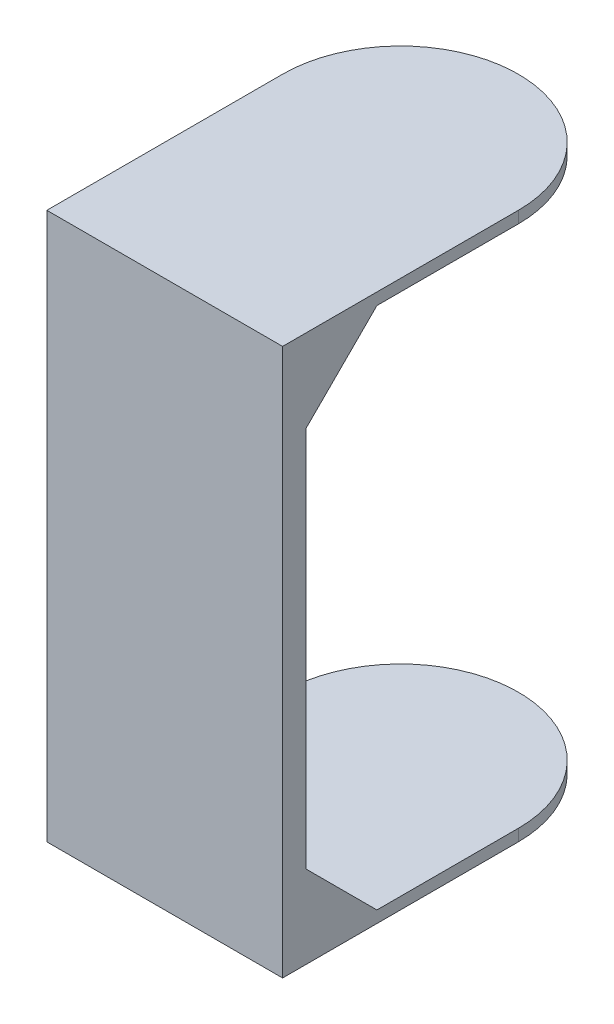
ISO-10303-21;
HEADER;
FILE_DESCRIPTION(('STEP AP214'),'2;1');
FILE_NAME('part.step','',(''),(''),'','','');
FILE_SCHEMA(('AUTOMOTIVE_DESIGN { 1 0 10303 214 1 1 1 1 }'));
ENDSEC;
DATA;
#1=APPLICATION_CONTEXT('core data for automotive mechanical design processes');
#2=APPLICATION_PROTOCOL_DEFINITION('international standard','automotive_design',2000,#1);
#3=PRODUCT_CONTEXT('',#1,'mechanical');
#4=PRODUCT('Part','Part','',(#3));
#5=PRODUCT_RELATED_PRODUCT_CATEGORY('part','',(#4));
#6=PRODUCT_DEFINITION_FORMATION('','',#4);
#7=PRODUCT_DEFINITION_CONTEXT('part definition',#1,'design');
#8=PRODUCT_DEFINITION('design','',#6,#7);
#9=PRODUCT_DEFINITION_SHAPE('','',#8);
#10=(LENGTH_UNIT() NAMED_UNIT(*) SI_UNIT(.MILLI.,.METRE.));
#11=(NAMED_UNIT(*) PLANE_ANGLE_UNIT() SI_UNIT($,.RADIAN.));
#12=(NAMED_UNIT(*) SI_UNIT($,.STERADIAN.) SOLID_ANGLE_UNIT());
#13=UNCERTAINTY_MEASURE_WITH_UNIT(LENGTH_MEASURE(1.E-05),#10,'distance_accuracy_value','');
#14=(GEOMETRIC_REPRESENTATION_CONTEXT(3) GLOBAL_UNCERTAINTY_ASSIGNED_CONTEXT((#13)) GLOBAL_UNIT_ASSIGNED_CONTEXT((#10,
#11,#12)) REPRESENTATION_CONTEXT('',''));
#15=CARTESIAN_POINT('',(0.,0.,0.));
#16=DIRECTION('',(0.,0.,1.));
#17=DIRECTION('',(1.,0.,0.));
#18=AXIS2_PLACEMENT_3D('',#15,#16,#17);
#19=CARTESIAN_POINT('',(0.,0.,-10.));
#20=DIRECTION('',(0.,0.,1.));
#21=DIRECTION('',(1.,0.,0.));
#22=AXIS2_PLACEMENT_3D('',#19,#20,#21);
#23=PLANE('',#22);
#24=DIRECTION('',(0.,-1.,0.));
#25=VECTOR('',#24,1.);
#26=CARTESIAN_POINT('',(-50.,111.,-10.));
#27=LINE('',#26,#25);
#28=CARTESIAN_POINT('',(-50.,81.,-10.));
#29=VERTEX_POINT('',#28);
#30=CARTESIAN_POINT('',(-50.,-111.,-10.));
#31=VERTEX_POINT('',#30);
#32=EDGE_CURVE('E49',#29,#31,#27,.T.);
#33=ORIENTED_EDGE('',*,*,#32,.F.);
#34=DIRECTION('',(-1.,0.,0.));
#35=VECTOR('',#34,1.);
#36=CARTESIAN_POINT('',(-40.,81.,-10.));
#37=LINE('',#36,#35);
#38=CARTESIAN_POINT('',(-40.,81.,-10.));
#39=VERTEX_POINT('',#38);
#40=EDGE_CURVE('E237',#39,#29,#37,.T.);
#41=ORIENTED_EDGE('',*,*,#40,.F.);
#42=DIRECTION('',(0.,1.,0.));
#43=VECTOR('',#42,1.);
#44=CARTESIAN_POINT('',(-40.,111.,-10.));
#45=LINE('',#44,#43);
#46=CARTESIAN_POINT('',(-40.,111.,-10.));
#47=VERTEX_POINT('',#46);
#48=EDGE_CURVE('E221',#39,#47,#45,.T.);
#49=ORIENTED_EDGE('',*,*,#48,.T.);
#50=DIRECTION('',(-1.,0.,0.));
#51=VECTOR('',#50,1.);
#52=CARTESIAN_POINT('',(-50.,111.,-10.));
#53=LINE('',#52,#51);
#54=CARTESIAN_POINT('',(40.,111.,-10.));
#55=VERTEX_POINT('',#54);
#56=EDGE_CURVE('E285',#55,#47,#53,.T.);
#57=ORIENTED_EDGE('',*,*,#56,.F.);
#58=DIRECTION('',(0.,-1.,0.));
#59=VECTOR('',#58,1.);
#60=CARTESIAN_POINT('',(40.,111.,-10.));
#61=LINE('',#60,#59);
#62=CARTESIAN_POINT('',(40.,81.,-10.));
#63=VERTEX_POINT('',#62);
#64=EDGE_CURVE('E266',#55,#63,#61,.T.);
#65=ORIENTED_EDGE('',*,*,#64,.T.);
#66=DIRECTION('',(1.,0.,0.));
#67=VECTOR('',#66,1.);
#68=CARTESIAN_POINT('',(40.,81.,-10.));
#69=LINE('',#68,#67);
#70=CARTESIAN_POINT('',(50.,81.,-10.));
#71=VERTEX_POINT('',#70);
#72=EDGE_CURVE('E274',#63,#71,#69,.T.);
#73=ORIENTED_EDGE('',*,*,#72,.T.);
#74=DIRECTION('',(0.,1.,0.));
#75=VECTOR('',#74,1.);
#76=CARTESIAN_POINT('',(50.,111.,-10.));
#77=LINE('',#76,#75);
#78=CARTESIAN_POINT('',(50.,-81.,-10.));
#79=VERTEX_POINT('',#78);
#80=EDGE_CURVE('E62',#79,#71,#77,.T.);
#81=ORIENTED_EDGE('',*,*,#80,.F.);
#82=DIRECTION('',(1.,0.,0.));
#83=VECTOR('',#82,1.);
#84=CARTESIAN_POINT('',(40.,-81.,-10.));
#85=LINE('',#84,#83);
#86=CARTESIAN_POINT('',(40.,-81.,-10.));
#87=VERTEX_POINT('',#86);
#88=EDGE_CURVE('E255',#87,#79,#85,.T.);
#89=ORIENTED_EDGE('',*,*,#88,.F.);
#90=DIRECTION('',(0.,1.,0.));
#91=VECTOR('',#90,1.);
#92=CARTESIAN_POINT('',(40.,-111.,-10.));
#93=LINE('',#92,#91);
#94=CARTESIAN_POINT('',(40.,-111.,-10.));
#95=VERTEX_POINT('',#94);
#96=EDGE_CURVE('E249',#95,#87,#93,.T.);
#97=ORIENTED_EDGE('',*,*,#96,.F.);
#98=DIRECTION('',(1.,0.,0.));
#99=VECTOR('',#98,1.);
#100=CARTESIAN_POINT('',(-50.,-111.,-10.));
#101=LINE('',#100,#99);
#102=EDGE_CURVE('E11',#31,#95,#101,.T.);
#103=ORIENTED_EDGE('',*,*,#102,.F.);
#104=EDGE_LOOP('',(#33,#41,#49,#57,#65,#73,#81,#89,#97,#103));
#105=FACE_BOUND('',#104,.T.);
#106=ADVANCED_FACE('F39',(#105),#23,.F.);
#107=CARTESIAN_POINT('',(50.,111.,-10.));
#108=DIRECTION('',(1.,0.,0.));
#109=DIRECTION('',(0.,1.,0.));
#110=AXIS2_PLACEMENT_3D('',#107,#108,#109);
#111=PLANE('',#110);
#112=DIRECTION('',(0.,1.,0.));
#113=VECTOR('',#112,1.);
#114=CARTESIAN_POINT('',(50.,111.,0.));
#115=LINE('',#114,#113);
#116=CARTESIAN_POINT('',(50.,-116.,0.));
#117=VERTEX_POINT('',#116);
#118=CARTESIAN_POINT('',(50.,116.,0.));
#119=VERTEX_POINT('',#118);
#120=EDGE_CURVE('E168',#117,#119,#115,.T.);
#121=ORIENTED_EDGE('',*,*,#120,.F.);
#122=DIRECTION('',(0.,0.,-1.));
#123=VECTOR('',#122,1.);
#124=CARTESIAN_POINT('',(50.,-116.,0.));
#125=LINE('',#124,#123);
#126=CARTESIAN_POINT('',(50.,-116.,-100.));
#127=VERTEX_POINT('',#126);
#128=EDGE_CURVE('E160',#117,#127,#125,.T.);
#129=ORIENTED_EDGE('',*,*,#128,.T.);
#130=DIRECTION('',(0.,1.,0.));
#131=VECTOR('',#130,1.);
#132=CARTESIAN_POINT('',(50.,-116.,-100.));
#133=LINE('',#132,#131);
#134=CARTESIAN_POINT('',(50.,-111.,-100.));
#135=VERTEX_POINT('',#134);
#136=EDGE_CURVE('E144',#127,#135,#133,.T.);
#137=ORIENTED_EDGE('',*,*,#136,.T.);
#138=DIRECTION('',(0.,0.,-1.));
#139=VECTOR('',#138,1.);
#140=CARTESIAN_POINT('',(50.,-111.,0.));
#141=LINE('',#140,#139);
#142=CARTESIAN_POINT('',(50.,-111.,-40.));
#143=VERTEX_POINT('',#142);
#144=EDGE_CURVE('E179',#143,#135,#141,.T.);
#145=ORIENTED_EDGE('',*,*,#144,.F.);
#146=DIRECTION('',(0.,-0.707106781186548,-0.707106781186547));
#147=VECTOR('',#146,1.);
#148=CARTESIAN_POINT('',(50.,-81.,-10.));
#149=LINE('',#148,#147);
#150=EDGE_CURVE('E57',#79,#143,#149,.T.);
#151=ORIENTED_EDGE('',*,*,#150,.F.);
#152=ORIENTED_EDGE('',*,*,#80,.T.);
#153=DIRECTION('',(0.,0.707106781186548,-0.707106781186547));
#154=VECTOR('',#153,1.);
#155=CARTESIAN_POINT('',(50.,81.,-10.));
#156=LINE('',#155,#154);
#157=CARTESIAN_POINT('',(50.,111.,-40.));
#158=VERTEX_POINT('',#157);
#159=EDGE_CURVE('E258',#71,#158,#156,.T.);
#160=ORIENTED_EDGE('',*,*,#159,.T.);
#161=DIRECTION('',(0.,0.,-1.));
#162=VECTOR('',#161,1.);
#163=CARTESIAN_POINT('',(50.,111.,0.));
#164=LINE('',#163,#162);
#165=CARTESIAN_POINT('',(50.,111.,-100.));
#166=VERTEX_POINT('',#165);
#167=EDGE_CURVE('E192',#158,#166,#164,.T.);
#168=ORIENTED_EDGE('',*,*,#167,.T.);
#169=DIRECTION('',(0.,-1.,0.));
#170=VECTOR('',#169,1.);
#171=CARTESIAN_POINT('',(50.,116.,-100.));
#172=LINE('',#171,#170);
#173=CARTESIAN_POINT('',(50.,116.,-100.));
#174=VERTEX_POINT('',#173);
#175=EDGE_CURVE('E203',#174,#166,#172,.T.);
#176=ORIENTED_EDGE('',*,*,#175,.F.);
#177=DIRECTION('',(0.,0.,-1.));
#178=VECTOR('',#177,1.);
#179=CARTESIAN_POINT('',(50.,116.,0.));
#180=LINE('',#179,#178);
#181=EDGE_CURVE('E200',#119,#174,#180,.T.);
#182=ORIENTED_EDGE('',*,*,#181,.F.);
#183=EDGE_LOOP('',(#121,#129,#137,#145,#151,#152,#160,#168,#176,#182));
#184=FACE_BOUND('',#183,.T.);
#185=ADVANCED_FACE('F41',(#184),#111,.T.);
#186=CARTESIAN_POINT('',(-50.,111.,-10.));
#187=DIRECTION('',(-1.,0.,0.));
#188=DIRECTION('',(0.,-1.,0.));
#189=AXIS2_PLACEMENT_3D('',#186,#187,#188);
#190=PLANE('',#189);
#191=DIRECTION('',(0.,-1.,0.));
#192=VECTOR('',#191,1.);
#193=CARTESIAN_POINT('',(-50.,111.,0.));
#194=LINE('',#193,#192);
#195=CARTESIAN_POINT('',(-50.,116.,0.));
#196=VERTEX_POINT('',#195);
#197=CARTESIAN_POINT('',(-50.,-116.,0.));
#198=VERTEX_POINT('',#197);
#199=EDGE_CURVE('E43',#196,#198,#194,.T.);
#200=ORIENTED_EDGE('',*,*,#199,.F.);
#201=DIRECTION('',(0.,0.,1.));
#202=VECTOR('',#201,1.);
#203=CARTESIAN_POINT('',(-50.,116.,0.));
#204=LINE('',#203,#202);
#205=CARTESIAN_POINT('',(-50.,116.,-100.));
#206=VERTEX_POINT('',#205);
#207=EDGE_CURVE('E191',#206,#196,#204,.T.);
#208=ORIENTED_EDGE('',*,*,#207,.F.);
#209=DIRECTION('',(0.,-1.,0.));
#210=VECTOR('',#209,1.);
#211=CARTESIAN_POINT('',(-50.,116.,-100.));
#212=LINE('',#211,#210);
#213=CARTESIAN_POINT('',(-50.,111.,-100.));
#214=VERTEX_POINT('',#213);
#215=EDGE_CURVE('E216',#206,#214,#212,.T.);
#216=ORIENTED_EDGE('',*,*,#215,.T.);
#217=DIRECTION('',(0.,0.,1.));
#218=VECTOR('',#217,1.);
#219=CARTESIAN_POINT('',(-50.,111.,0.));
#220=LINE('',#219,#218);
#221=CARTESIAN_POINT('',(-50.,111.,-40.));
#222=VERTEX_POINT('',#221);
#223=EDGE_CURVE('E207',#214,#222,#220,.T.);
#224=ORIENTED_EDGE('',*,*,#223,.T.);
#225=DIRECTION('',(0.,-0.707106781186548,0.707106781186547));
#226=VECTOR('',#225,1.);
#227=CARTESIAN_POINT('',(-50.,81.,-10.));
#228=LINE('',#227,#226);
#229=EDGE_CURVE('E220',#222,#29,#228,.T.);
#230=ORIENTED_EDGE('',*,*,#229,.T.);
#231=ORIENTED_EDGE('',*,*,#32,.T.);
#232=DIRECTION('',(0.,0.,1.));
#233=VECTOR('',#232,1.);
#234=CARTESIAN_POINT('',(-50.,-111.,0.));
#235=LINE('',#234,#233);
#236=CARTESIAN_POINT('',(-50.,-111.,-100.));
#237=VERTEX_POINT('',#236);
#238=EDGE_CURVE('E165',#237,#31,#235,.T.);
#239=ORIENTED_EDGE('',*,*,#238,.F.);
#240=DIRECTION('',(0.,1.,0.));
#241=VECTOR('',#240,1.);
#242=CARTESIAN_POINT('',(-50.,-116.,-100.));
#243=LINE('',#242,#241);
#244=CARTESIAN_POINT('',(-50.,-116.,-100.));
#245=VERTEX_POINT('',#244);
#246=EDGE_CURVE('E154',#245,#237,#243,.T.);
#247=ORIENTED_EDGE('',*,*,#246,.F.);
#248=DIRECTION('',(0.,0.,1.));
#249=VECTOR('',#248,1.);
#250=CARTESIAN_POINT('',(-50.,-116.,0.));
#251=LINE('',#250,#249);
#252=EDGE_CURVE('E163',#245,#198,#251,.T.);
#253=ORIENTED_EDGE('',*,*,#252,.T.);
#254=EDGE_LOOP('',(#200,#208,#216,#224,#230,#231,#239,#247,#253));
#255=FACE_BOUND('',#254,.T.);
#256=ADVANCED_FACE('F296',(#255),#190,.T.);
#257=CARTESIAN_POINT('',(0.,0.,0.));
#258=DIRECTION('',(0.,0.,1.));
#259=DIRECTION('',(1.,0.,0.));
#260=AXIS2_PLACEMENT_3D('',#257,#258,#259);
#261=PLANE('',#260);
#262=ORIENTED_EDGE('',*,*,#120,.T.);
#263=DIRECTION('',(1.,0.,0.));
#264=VECTOR('',#263,1.);
#265=CARTESIAN_POINT('',(-50.,116.,0.));
#266=LINE('',#265,#264);
#267=EDGE_CURVE('E196',#196,#119,#266,.T.);
#268=ORIENTED_EDGE('',*,*,#267,.F.);
#269=ORIENTED_EDGE('',*,*,#199,.T.);
#270=DIRECTION('',(1.,0.,0.));
#271=VECTOR('',#270,1.);
#272=CARTESIAN_POINT('',(-50.,-116.,0.));
#273=LINE('',#272,#271);
#274=EDGE_CURVE('E170',#198,#117,#273,.T.);
#275=ORIENTED_EDGE('',*,*,#274,.T.);
#276=EDGE_LOOP('',(#262,#268,#269,#275));
#277=FACE_BOUND('',#276,.T.);
#278=ADVANCED_FACE('F294',(#277),#261,.T.);
#279=CARTESIAN_POINT('',(40.,81.,-10.));
#280=DIRECTION('',(0.,-0.707106781186547,-0.707106781186548));
#281=DIRECTION('',(0.,0.707106781186548,-0.707106781186547));
#282=AXIS2_PLACEMENT_3D('',#279,#280,#281);
#283=PLANE('',#282);
#284=ORIENTED_EDGE('',*,*,#159,.F.);
#285=ORIENTED_EDGE('',*,*,#72,.F.);
#286=DIRECTION('',(0.,0.707106781186548,-0.707106781186547));
#287=VECTOR('',#286,1.);
#288=CARTESIAN_POINT('',(40.,81.,-10.));
#289=LINE('',#288,#287);
#290=CARTESIAN_POINT('',(40.,111.,-40.));
#291=VERTEX_POINT('',#290);
#292=EDGE_CURVE('E270',#63,#291,#289,.T.);
#293=ORIENTED_EDGE('',*,*,#292,.T.);
#294=DIRECTION('',(1.,0.,0.));
#295=VECTOR('',#294,1.);
#296=CARTESIAN_POINT('',(40.,111.,-40.));
#297=LINE('',#296,#295);
#298=EDGE_CURVE('E277',#291,#158,#297,.T.);
#299=ORIENTED_EDGE('',*,*,#298,.T.);
#300=EDGE_LOOP('',(#284,#285,#293,#299));
#301=FACE_BOUND('',#300,.T.);
#302=ADVANCED_FACE('F312',(#301),#283,.T.);
#303=CARTESIAN_POINT('',(40.,0.,0.));
#304=DIRECTION('',(1.,0.,0.));
#305=DIRECTION('',(0.,1.,0.));
#306=AXIS2_PLACEMENT_3D('',#303,#304,#305);
#307=PLANE('',#306);
#308=DIRECTION('',(0.,0.,1.));
#309=VECTOR('',#308,1.);
#310=CARTESIAN_POINT('',(40.,111.,-40.));
#311=LINE('',#310,#309);
#312=EDGE_CURVE('E262',#291,#55,#311,.T.);
#313=ORIENTED_EDGE('',*,*,#312,.F.);
#314=ORIENTED_EDGE('',*,*,#292,.F.);
#315=ORIENTED_EDGE('',*,*,#64,.F.);
#316=EDGE_LOOP('',(#313,#314,#315));
#317=FACE_BOUND('',#316,.T.);
#318=ADVANCED_FACE('F315',(#317),#307,.F.);
#319=CARTESIAN_POINT('',(40.,-81.,-10.));
#320=DIRECTION('',(0.,-0.707106781186547,0.707106781186548));
#321=DIRECTION('',(0.,-0.707106781186548,-0.707106781186547));
#322=AXIS2_PLACEMENT_3D('',#319,#320,#321);
#323=PLANE('',#322);
#324=ORIENTED_EDGE('',*,*,#150,.T.);
#325=DIRECTION('',(1.,0.,0.));
#326=VECTOR('',#325,1.);
#327=CARTESIAN_POINT('',(40.,-111.,-40.));
#328=LINE('',#327,#326);
#329=CARTESIAN_POINT('',(40.,-111.,-40.));
#330=VERTEX_POINT('',#329);
#331=EDGE_CURVE('E252',#330,#143,#328,.T.);
#332=ORIENTED_EDGE('',*,*,#331,.F.);
#333=DIRECTION('',(0.,-0.707106781186548,-0.707106781186547));
#334=VECTOR('',#333,1.);
#335=CARTESIAN_POINT('',(40.,-81.,-10.));
#336=LINE('',#335,#334);
#337=EDGE_CURVE('E246',#87,#330,#336,.T.);
#338=ORIENTED_EDGE('',*,*,#337,.F.);
#339=ORIENTED_EDGE('',*,*,#88,.T.);
#340=EDGE_LOOP('',(#324,#332,#338,#339));
#341=FACE_BOUND('',#340,.T.);
#342=ADVANCED_FACE('F304',(#341),#323,.F.);
#343=CARTESIAN_POINT('',(40.,0.,0.));
#344=DIRECTION('',(1.,0.,0.));
#345=DIRECTION('',(0.,-1.,0.));
#346=AXIS2_PLACEMENT_3D('',#343,#344,#345);
#347=PLANE('',#346);
#348=DIRECTION('',(0.,0.,1.));
#349=VECTOR('',#348,1.);
#350=CARTESIAN_POINT('',(40.,-111.,-40.));
#351=LINE('',#350,#349);
#352=EDGE_CURVE('E243',#330,#95,#351,.T.);
#353=ORIENTED_EDGE('',*,*,#352,.T.);
#354=ORIENTED_EDGE('',*,*,#96,.T.);
#355=ORIENTED_EDGE('',*,*,#337,.T.);
#356=EDGE_LOOP('',(#353,#354,#355));
#357=FACE_BOUND('',#356,.T.);
#358=ADVANCED_FACE('F372',(#357),#347,.F.);
#359=CARTESIAN_POINT('',(-40.,81.,-10.));
#360=DIRECTION('',(0.,-0.707106781186547,-0.707106781186548));
#361=DIRECTION('',(0.,0.707106781186548,-0.707106781186547));
#362=AXIS2_PLACEMENT_3D('',#359,#360,#361);
#363=PLANE('',#362);
#364=ORIENTED_EDGE('',*,*,#229,.F.);
#365=DIRECTION('',(-1.,0.,0.));
#366=VECTOR('',#365,1.);
#367=CARTESIAN_POINT('',(-40.,111.,-40.));
#368=LINE('',#367,#366);
#369=CARTESIAN_POINT('',(-40.,111.,-40.));
#370=VERTEX_POINT('',#369);
#371=EDGE_CURVE('E233',#370,#222,#368,.T.);
#372=ORIENTED_EDGE('',*,*,#371,.F.);
#373=DIRECTION('',(0.,-0.707106781186548,0.707106781186547));
#374=VECTOR('',#373,1.);
#375=CARTESIAN_POINT('',(-40.,81.,-10.));
#376=LINE('',#375,#374);
#377=EDGE_CURVE('E229',#370,#39,#376,.T.);
#378=ORIENTED_EDGE('',*,*,#377,.T.);
#379=ORIENTED_EDGE('',*,*,#40,.T.);
#380=EDGE_LOOP('',(#364,#372,#378,#379));
#381=FACE_BOUND('',#380,.T.);
#382=ADVANCED_FACE('F379',(#381),#363,.T.);
#383=CARTESIAN_POINT('',(-40.,0.,0.));
#384=DIRECTION('',(-1.,0.,0.));
#385=DIRECTION('',(0.,-1.,0.));
#386=AXIS2_PLACEMENT_3D('',#383,#384,#385);
#387=PLANE('',#386);
#388=ORIENTED_EDGE('',*,*,#48,.F.);
#389=ORIENTED_EDGE('',*,*,#377,.F.);
#390=DIRECTION('',(0.,0.,-1.));
#391=VECTOR('',#390,1.);
#392=CARTESIAN_POINT('',(-40.,111.,-40.));
#393=LINE('',#392,#391);
#394=EDGE_CURVE('E225',#47,#370,#393,.T.);
#395=ORIENTED_EDGE('',*,*,#394,.F.);
#396=EDGE_LOOP('',(#388,#389,#395));
#397=FACE_BOUND('',#396,.T.);
#398=ADVANCED_FACE('F334',(#397),#387,.F.);
#399=CARTESIAN_POINT('',(0.,116.,-100.));
#400=DIRECTION('',(0.,-1.,0.));
#401=DIRECTION('',(0.,0.,-1.));
#402=AXIS2_PLACEMENT_3D('',#399,#400,#401);
#403=CYLINDRICAL_SURFACE('',#402,50.);
#404=CARTESIAN_POINT('',(0.,111.,-100.));
#405=DIRECTION('',(0.,1.,0.));
#406=DIRECTION('',(0.,0.,1.));
#407=AXIS2_PLACEMENT_3D('',#404,#405,#406);
#408=CIRCLE('',#407,50.);
#409=EDGE_CURVE('E153',#166,#214,#408,.T.);
#410=ORIENTED_EDGE('',*,*,#409,.T.);
#411=ORIENTED_EDGE('',*,*,#215,.F.);
#412=CARTESIAN_POINT('',(0.,116.,-100.));
#413=DIRECTION('',(0.,1.,0.));
#414=DIRECTION('',(0.,0.,1.));
#415=AXIS2_PLACEMENT_3D('',#412,#413,#414);
#416=CIRCLE('',#415,50.);
#417=EDGE_CURVE('E187',#174,#206,#416,.T.);
#418=ORIENTED_EDGE('',*,*,#417,.F.);
#419=ORIENTED_EDGE('',*,*,#175,.T.);
#420=EDGE_LOOP('',(#410,#411,#418,#419));
#421=FACE_BOUND('',#420,.T.);
#422=ADVANCED_FACE('F323',(#421),#403,.T.);
#423=CARTESIAN_POINT('',(0.,116.,-100.));
#424=DIRECTION('',(0.,1.,0.));
#425=DIRECTION('',(0.,0.,1.));
#426=AXIS2_PLACEMENT_3D('',#423,#424,#425);
#427=PLANE('',#426);
#428=ORIENTED_EDGE('',*,*,#417,.T.);
#429=ORIENTED_EDGE('',*,*,#207,.T.);
#430=ORIENTED_EDGE('',*,*,#267,.T.);
#431=ORIENTED_EDGE('',*,*,#181,.T.);
#432=EDGE_LOOP('',(#428,#429,#430,#431));
#433=FACE_BOUND('',#432,.T.);
#434=ADVANCED_FACE('F326',(#433),#427,.T.);
#435=CARTESIAN_POINT('',(0.,111.,-100.));
#436=DIRECTION('',(0.,1.,0.));
#437=DIRECTION('',(0.,0.,1.));
#438=AXIS2_PLACEMENT_3D('',#435,#436,#437);
#439=PLANE('',#438);
#440=ORIENTED_EDGE('',*,*,#298,.F.);
#441=ORIENTED_EDGE('',*,*,#312,.T.);
#442=ORIENTED_EDGE('',*,*,#56,.T.);
#443=ORIENTED_EDGE('',*,*,#394,.T.);
#444=ORIENTED_EDGE('',*,*,#371,.T.);
#445=ORIENTED_EDGE('',*,*,#223,.F.);
#446=ORIENTED_EDGE('',*,*,#409,.F.);
#447=ORIENTED_EDGE('',*,*,#167,.F.);
#448=EDGE_LOOP('',(#440,#441,#442,#443,#444,#445,#446,#447));
#449=FACE_BOUND('',#448,.T.);
#450=ADVANCED_FACE('F317',(#449),#439,.F.);
#451=CARTESIAN_POINT('',(0.,-111.,-100.));
#452=DIRECTION('',(0.,-1.,0.));
#453=DIRECTION('',(0.,0.,1.));
#454=AXIS2_PLACEMENT_3D('',#451,#452,#453);
#455=PLANE('',#454);
#456=ORIENTED_EDGE('',*,*,#238,.T.);
#457=ORIENTED_EDGE('',*,*,#102,.T.);
#458=ORIENTED_EDGE('',*,*,#352,.F.);
#459=ORIENTED_EDGE('',*,*,#331,.T.);
#460=ORIENTED_EDGE('',*,*,#144,.T.);
#461=CARTESIAN_POINT('',(0.,-111.,-100.));
#462=DIRECTION('',(0.,1.,0.));
#463=DIRECTION('',(0.,0.,1.));
#464=AXIS2_PLACEMENT_3D('',#461,#462,#463);
#465=CIRCLE('',#464,50.);
#466=EDGE_CURVE('E150',#135,#237,#465,.T.);
#467=ORIENTED_EDGE('',*,*,#466,.T.);
#468=EDGE_LOOP('',(#456,#457,#458,#459,#460,#467));
#469=FACE_BOUND('',#468,.T.);
#470=ADVANCED_FACE('F299',(#469),#455,.F.);
#471=CARTESIAN_POINT('',(0.,-116.,-100.));
#472=DIRECTION('',(0.,1.,0.));
#473=DIRECTION('',(0.,0.,1.));
#474=AXIS2_PLACEMENT_3D('',#471,#472,#473);
#475=CYLINDRICAL_SURFACE('',#474,50.);
#476=ORIENTED_EDGE('',*,*,#466,.F.);
#477=ORIENTED_EDGE('',*,*,#136,.F.);
#478=CARTESIAN_POINT('',(0.,-116.,-100.));
#479=DIRECTION('',(0.,1.,0.));
#480=DIRECTION('',(0.,0.,1.));
#481=AXIS2_PLACEMENT_3D('',#478,#479,#480);
#482=CIRCLE('',#481,50.);
#483=EDGE_CURVE('E147',#127,#245,#482,.T.);
#484=ORIENTED_EDGE('',*,*,#483,.T.);
#485=ORIENTED_EDGE('',*,*,#246,.T.);
#486=EDGE_LOOP('',(#476,#477,#484,#485));
#487=FACE_BOUND('',#486,.T.);
#488=ADVANCED_FACE('F146',(#487),#475,.T.);
#489=CARTESIAN_POINT('',(0.,-116.,-100.));
#490=DIRECTION('',(0.,-1.,0.));
#491=DIRECTION('',(0.,0.,1.));
#492=AXIS2_PLACEMENT_3D('',#489,#490,#491);
#493=PLANE('',#492);
#494=ORIENTED_EDGE('',*,*,#483,.F.);
#495=ORIENTED_EDGE('',*,*,#128,.F.);
#496=ORIENTED_EDGE('',*,*,#274,.F.);
#497=ORIENTED_EDGE('',*,*,#252,.F.);
#498=EDGE_LOOP('',(#494,#495,#496,#497));
#499=FACE_BOUND('',#498,.T.);
#500=ADVANCED_FACE('F158',(#499),#493,.T.);
#501=CLOSED_SHELL('',(#106,#185,#256,#278,#302,#318,#342,#358,#382,#398,#422,#434,#450,#470,
#488,#500));
#502=MANIFOLD_SOLID_BREP('B2',#501);
#503=ADVANCED_BREP_SHAPE_REPRESENTATION('',(#18,#502),#14);
#504=SHAPE_DEFINITION_REPRESENTATION(#9,#503);
ENDSEC;
END-ISO-10303-21;
